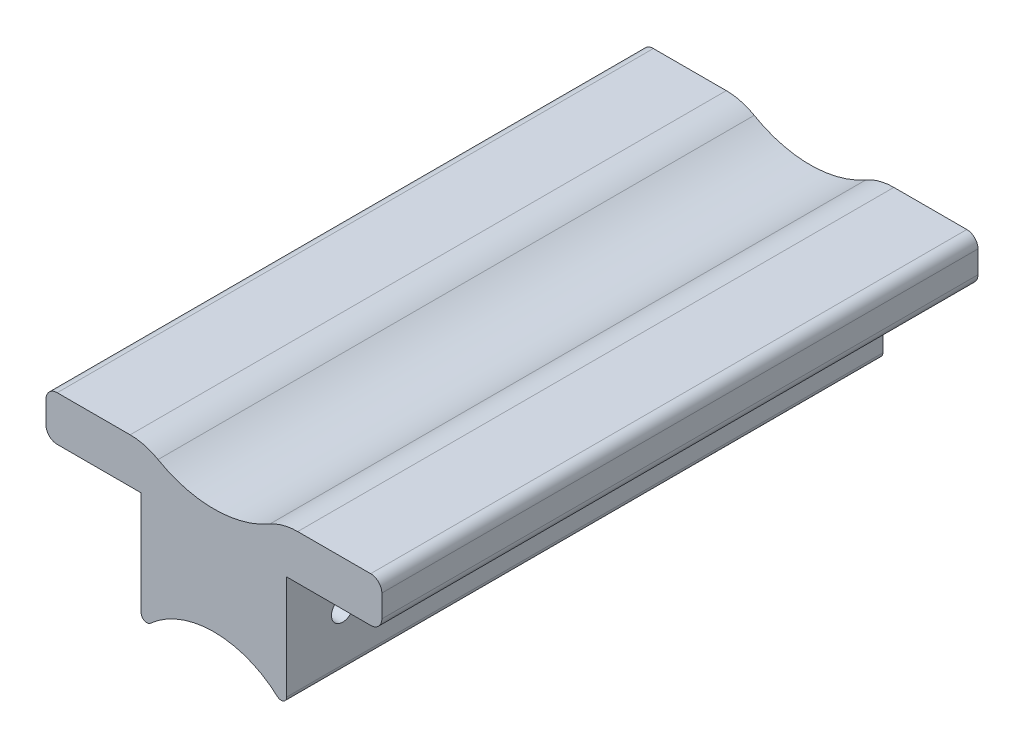
ISO-10303-21;
HEADER;
FILE_DESCRIPTION(('STEP AP214'),'2;1');
FILE_NAME('part.step','',(''),(''),'','','');
FILE_SCHEMA(('AUTOMOTIVE_DESIGN { 1 0 10303 214 1 1 1 1 }'));
ENDSEC;
DATA;
#1=APPLICATION_CONTEXT('core data for automotive mechanical design processes');
#2=APPLICATION_PROTOCOL_DEFINITION('international standard','automotive_design',2000,#1);
#3=PRODUCT_CONTEXT('',#1,'mechanical');
#4=PRODUCT('Part','Part','',(#3));
#5=PRODUCT_RELATED_PRODUCT_CATEGORY('part','',(#4));
#6=PRODUCT_DEFINITION_FORMATION('','',#4);
#7=PRODUCT_DEFINITION_CONTEXT('part definition',#1,'design');
#8=PRODUCT_DEFINITION('design','',#6,#7);
#9=PRODUCT_DEFINITION_SHAPE('','',#8);
#10=(LENGTH_UNIT() NAMED_UNIT(*) SI_UNIT(.MILLI.,.METRE.));
#11=(NAMED_UNIT(*) PLANE_ANGLE_UNIT() SI_UNIT($,.RADIAN.));
#12=(NAMED_UNIT(*) SI_UNIT($,.STERADIAN.) SOLID_ANGLE_UNIT());
#13=UNCERTAINTY_MEASURE_WITH_UNIT(LENGTH_MEASURE(1.E-05),#10,'distance_accuracy_value','');
#14=(GEOMETRIC_REPRESENTATION_CONTEXT(3) GLOBAL_UNCERTAINTY_ASSIGNED_CONTEXT((#13)) GLOBAL_UNIT_ASSIGNED_CONTEXT((#10,
#11,#12)) REPRESENTATION_CONTEXT('',''));
#15=CARTESIAN_POINT('',(0.,0.,0.));
#16=DIRECTION('',(0.,0.,1.));
#17=DIRECTION('',(1.,0.,0.));
#18=AXIS2_PLACEMENT_3D('',#15,#16,#17);
#19=CARTESIAN_POINT('',(-30.,40.,106.5));
#20=DIRECTION('',(0.,-1.,0.));
#21=DIRECTION('',(0.,0.,-1.));
#22=AXIS2_PLACEMENT_3D('',#19,#20,#21);
#23=PLANE('',#22);
#24=DIRECTION('',(-1.,0.,0.));
#25=VECTOR('',#24,1.);
#26=CARTESIAN_POINT('',(-30.,40.,0.));
#27=LINE('',#26,#25);
#28=CARTESIAN_POINT('',(-14.9666295470958,40.,0.));
#29=VERTEX_POINT('',#28);
#30=CARTESIAN_POINT('',(-28.,40.,0.));
#31=VERTEX_POINT('',#30);
#32=EDGE_CURVE('E221',#29,#31,#27,.T.);
#33=ORIENTED_EDGE('',*,*,#32,.T.);
#34=DIRECTION('',(0.,0.,-1.));
#35=VECTOR('',#34,1.);
#36=CARTESIAN_POINT('',(-28.,40.,106.5));
#37=LINE('',#36,#35);
#38=CARTESIAN_POINT('',(-28.,40.,106.5));
#39=VERTEX_POINT('',#38);
#40=EDGE_CURVE('E266',#31,#39,#37,.F.);
#41=ORIENTED_EDGE('',*,*,#40,.T.);
#42=DIRECTION('',(-1.,0.,0.));
#43=VECTOR('',#42,1.);
#44=CARTESIAN_POINT('',(-30.,40.,106.5));
#45=LINE('',#44,#43);
#46=CARTESIAN_POINT('',(-14.9666295470958,40.,106.5));
#47=VERTEX_POINT('',#46);
#48=EDGE_CURVE('E201',#47,#39,#45,.T.);
#49=ORIENTED_EDGE('',*,*,#48,.F.);
#50=DIRECTION('',(0.,0.,-1.));
#51=VECTOR('',#50,1.);
#52=CARTESIAN_POINT('',(-14.9666295470958,40.,106.5));
#53=LINE('',#52,#51);
#54=EDGE_CURVE('E184',#47,#29,#53,.T.);
#55=ORIENTED_EDGE('',*,*,#54,.T.);
#56=EDGE_LOOP('',(#33,#41,#49,#55));
#57=FACE_BOUND('',#56,.T.);
#58=ADVANCED_FACE('F39',(#57),#23,.F.);
#59=CARTESIAN_POINT('',(-30.,32.,106.5));
#60=DIRECTION('',(1.,0.,0.));
#61=DIRECTION('',(0.,0.,-1.));
#62=AXIS2_PLACEMENT_3D('',#59,#60,#61);
#63=PLANE('',#62);
#64=DIRECTION('',(0.,-1.,0.));
#65=VECTOR('',#64,1.);
#66=CARTESIAN_POINT('',(-30.,32.,0.));
#67=LINE('',#66,#65);
#68=CARTESIAN_POINT('',(-30.,38.,0.));
#69=VERTEX_POINT('',#68);
#70=CARTESIAN_POINT('',(-30.,34.,0.));
#71=VERTEX_POINT('',#70);
#72=EDGE_CURVE('E204',#69,#71,#67,.T.);
#73=ORIENTED_EDGE('',*,*,#72,.T.);
#74=DIRECTION('',(0.,0.,-1.));
#75=VECTOR('',#74,1.);
#76=CARTESIAN_POINT('',(-30.,34.,106.5));
#77=LINE('',#76,#75);
#78=CARTESIAN_POINT('',(-30.,34.,106.5));
#79=VERTEX_POINT('',#78);
#80=EDGE_CURVE('E257',#71,#79,#77,.F.);
#81=ORIENTED_EDGE('',*,*,#80,.T.);
#82=DIRECTION('',(0.,-1.,0.));
#83=VECTOR('',#82,1.);
#84=CARTESIAN_POINT('',(-30.,32.,106.5));
#85=LINE('',#84,#83);
#86=CARTESIAN_POINT('',(-30.,38.,106.5));
#87=VERTEX_POINT('',#86);
#88=EDGE_CURVE('E176',#87,#79,#85,.T.);
#89=ORIENTED_EDGE('',*,*,#88,.F.);
#90=DIRECTION('',(0.,0.,-1.));
#91=VECTOR('',#90,1.);
#92=CARTESIAN_POINT('',(-30.,38.,106.5));
#93=LINE('',#92,#91);
#94=EDGE_CURVE('E254',#87,#69,#93,.T.);
#95=ORIENTED_EDGE('',*,*,#94,.T.);
#96=EDGE_LOOP('',(#73,#81,#89,#95));
#97=FACE_BOUND('',#96,.T.);
#98=ADVANCED_FACE('F311',(#97),#63,.F.);
#99=CARTESIAN_POINT('',(-30.,32.,106.5));
#100=DIRECTION('',(0.,1.,0.));
#101=DIRECTION('',(0.,0.,1.));
#102=AXIS2_PLACEMENT_3D('',#99,#100,#101);
#103=PLANE('',#102);
#104=DIRECTION('',(1.,0.,0.));
#105=VECTOR('',#104,1.);
#106=CARTESIAN_POINT('',(-30.,32.,106.5));
#107=LINE('',#106,#105);
#108=CARTESIAN_POINT('',(-28.,32.,106.5));
#109=VERTEX_POINT('',#108);
#110=CARTESIAN_POINT('',(-13.,32.,106.5));
#111=VERTEX_POINT('',#110);
#112=EDGE_CURVE('E165',#109,#111,#107,.T.);
#113=ORIENTED_EDGE('',*,*,#112,.F.);
#114=DIRECTION('',(0.,0.,-1.));
#115=VECTOR('',#114,1.);
#116=CARTESIAN_POINT('',(-28.,32.,106.5));
#117=LINE('',#116,#115);
#118=CARTESIAN_POINT('',(-28.,32.,0.));
#119=VERTEX_POINT('',#118);
#120=EDGE_CURVE('E244',#109,#119,#117,.T.);
#121=ORIENTED_EDGE('',*,*,#120,.T.);
#122=DIRECTION('',(1.,0.,0.));
#123=VECTOR('',#122,1.);
#124=CARTESIAN_POINT('',(-30.,32.,0.));
#125=LINE('',#124,#123);
#126=CARTESIAN_POINT('',(-13.,32.,0.));
#127=VERTEX_POINT('',#126);
#128=EDGE_CURVE('E182',#119,#127,#125,.T.);
#129=ORIENTED_EDGE('',*,*,#128,.T.);
#130=DIRECTION('',(0.,0.,-1.));
#131=VECTOR('',#130,1.);
#132=CARTESIAN_POINT('',(-13.,32.,106.5));
#133=LINE('',#132,#131);
#134=EDGE_CURVE('E179',#111,#127,#133,.T.);
#135=ORIENTED_EDGE('',*,*,#134,.F.);
#136=EDGE_LOOP('',(#113,#121,#129,#135));
#137=FACE_BOUND('',#136,.T.);
#138=ADVANCED_FACE('F180',(#137),#103,.F.);
#139=CARTESIAN_POINT('',(-13.,32.,106.5));
#140=DIRECTION('',(1.,0.,0.));
#141=DIRECTION('',(0.,1.,0.));
#142=AXIS2_PLACEMENT_3D('',#139,#140,#141);
#143=PLANE('',#142);
#144=CARTESIAN_POINT('',(-13.,22.,9.99999999999999));
#145=DIRECTION('',(1.,0.,0.));
#146=DIRECTION('',(0.,1.,0.));
#147=AXIS2_PLACEMENT_3D('',#144,#145,#146);
#148=CIRCLE('',#147,2.);
#149=CARTESIAN_POINT('',(-13.,24.,9.99999999999999));
#150=VERTEX_POINT('',#149);
#151=EDGE_CURVE('E403',#150,#150,#148,.T.);
#152=ORIENTED_EDGE('',*,*,#151,.T.);
#153=EDGE_LOOP('',(#152));
#154=FACE_BOUND('',#153,.T.);
#155=CARTESIAN_POINT('',(-13.,22.,96.5));
#156=DIRECTION('',(1.,0.,0.));
#157=DIRECTION('',(0.,1.,0.));
#158=AXIS2_PLACEMENT_3D('',#155,#156,#157);
#159=CIRCLE('',#158,2.);
#160=CARTESIAN_POINT('',(-13.,24.,96.5));
#161=VERTEX_POINT('',#160);
#162=EDGE_CURVE('E407',#161,#161,#159,.T.);
#163=ORIENTED_EDGE('',*,*,#162,.T.);
#164=EDGE_LOOP('',(#163));
#165=FACE_BOUND('',#164,.T.);
#166=DIRECTION('',(0.,-1.,0.));
#167=VECTOR('',#166,1.);
#168=CARTESIAN_POINT('',(-13.,32.,0.));
#169=LINE('',#168,#167);
#170=CARTESIAN_POINT('',(-13.,13.4164078649987,0.));
#171=VERTEX_POINT('',#170);
#172=EDGE_CURVE('E209',#127,#171,#169,.T.);
#173=ORIENTED_EDGE('',*,*,#172,.T.);
#174=DIRECTION('',(0.,0.,-1.));
#175=VECTOR('',#174,1.);
#176=CARTESIAN_POINT('',(-13.,13.4164078649987,106.5));
#177=LINE('',#176,#175);
#178=CARTESIAN_POINT('',(-13.,13.4164078649987,106.5));
#179=VERTEX_POINT('',#178);
#180=EDGE_CURVE('E11',#171,#179,#177,.F.);
#181=ORIENTED_EDGE('',*,*,#180,.T.);
#182=DIRECTION('',(0.,-1.,0.));
#183=VECTOR('',#182,1.);
#184=CARTESIAN_POINT('',(-13.,32.,106.5));
#185=LINE('',#184,#183);
#186=EDGE_CURVE('E168',#111,#179,#185,.T.);
#187=ORIENTED_EDGE('',*,*,#186,.F.);
#188=ORIENTED_EDGE('',*,*,#134,.T.);
#189=EDGE_LOOP('',(#173,#181,#187,#188));
#190=FACE_BOUND('',#189,.T.);
#191=ADVANCED_FACE('F187',(#154,#165,#190),#143,.F.);
#192=CARTESIAN_POINT('',(0.,0.,106.5));
#193=DIRECTION('',(0.,0.,-1.));
#194=DIRECTION('',(-1.,0.,0.));
#195=AXIS2_PLACEMENT_3D('',#192,#193,#194);
#196=CYLINDRICAL_SURFACE('',#195,17.);
#197=CARTESIAN_POINT('',(0.,0.,0.));
#198=DIRECTION('',(0.,0.,-1.));
#199=DIRECTION('',(-1.,0.,0.));
#200=AXIS2_PLACEMENT_3D('',#197,#198,#199);
#201=CIRCLE('',#200,17.);
#202=CARTESIAN_POINT('',(-11.3333333333333,12.6710518724988,0.));
#203=VERTEX_POINT('',#202);
#204=CARTESIAN_POINT('',(11.3333333333333,12.6710518724988,0.));
#205=VERTEX_POINT('',#204);
#206=EDGE_CURVE('E211',#203,#205,#201,.T.);
#207=ORIENTED_EDGE('',*,*,#206,.T.);
#208=DIRECTION('',(0.,0.,-1.));
#209=VECTOR('',#208,1.);
#210=CARTESIAN_POINT('',(11.3333333333333,12.6710518724988,106.5));
#211=LINE('',#210,#209);
#212=CARTESIAN_POINT('',(11.3333333333333,12.6710518724988,106.5));
#213=VERTEX_POINT('',#212);
#214=EDGE_CURVE('E60',#205,#213,#211,.F.);
#215=ORIENTED_EDGE('',*,*,#214,.T.);
#216=CARTESIAN_POINT('',(0.,0.,106.5));
#217=DIRECTION('',(0.,0.,-1.));
#218=DIRECTION('',(-1.,0.,0.));
#219=AXIS2_PLACEMENT_3D('',#216,#217,#218);
#220=CIRCLE('',#219,17.);
#221=CARTESIAN_POINT('',(-11.3333333333333,12.6710518724988,106.5));
#222=VERTEX_POINT('',#221);
#223=EDGE_CURVE('E188',#222,#213,#220,.T.);
#224=ORIENTED_EDGE('',*,*,#223,.F.);
#225=DIRECTION('',(0.,0.,-1.));
#226=VECTOR('',#225,1.);
#227=CARTESIAN_POINT('',(-11.3333333333333,12.6710518724988,106.5));
#228=LINE('',#227,#226);
#229=EDGE_CURVE('E285',#222,#203,#228,.T.);
#230=ORIENTED_EDGE('',*,*,#229,.T.);
#231=EDGE_LOOP('',(#207,#215,#224,#230));
#232=FACE_BOUND('',#231,.T.);
#233=ADVANCED_FACE('F304',(#232),#196,.F.);
#234=CARTESIAN_POINT('',(13.,32.,106.5));
#235=DIRECTION('',(-1.,0.,0.));
#236=DIRECTION('',(0.,-1.,0.));
#237=AXIS2_PLACEMENT_3D('',#234,#235,#236);
#238=PLANE('',#237);
#239=CARTESIAN_POINT('',(13.,22.,9.99999999999999));
#240=DIRECTION('',(1.,0.,0.));
#241=DIRECTION('',(0.,1.,0.));
#242=AXIS2_PLACEMENT_3D('',#239,#240,#241);
#243=CIRCLE('',#242,2.);
#244=CARTESIAN_POINT('',(13.,24.,9.99999999999999));
#245=VERTEX_POINT('',#244);
#246=EDGE_CURVE('E410',#245,#245,#243,.T.);
#247=ORIENTED_EDGE('',*,*,#246,.F.);
#248=EDGE_LOOP('',(#247));
#249=FACE_BOUND('',#248,.T.);
#250=CARTESIAN_POINT('',(13.,22.,96.5));
#251=DIRECTION('',(1.,0.,0.));
#252=DIRECTION('',(0.,1.,0.));
#253=AXIS2_PLACEMENT_3D('',#250,#251,#252);
#254=CIRCLE('',#253,2.);
#255=CARTESIAN_POINT('',(13.,24.,96.5));
#256=VERTEX_POINT('',#255);
#257=EDGE_CURVE('E411',#256,#256,#254,.T.);
#258=ORIENTED_EDGE('',*,*,#257,.F.);
#259=EDGE_LOOP('',(#258));
#260=FACE_BOUND('',#259,.T.);
#261=DIRECTION('',(0.,1.,0.));
#262=VECTOR('',#261,1.);
#263=CARTESIAN_POINT('',(13.,32.,106.5));
#264=LINE('',#263,#262);
#265=CARTESIAN_POINT('',(13.,13.4164078649987,106.5));
#266=VERTEX_POINT('',#265);
#267=CARTESIAN_POINT('',(13.,32.,106.5));
#268=VERTEX_POINT('',#267);
#269=EDGE_CURVE('E190',#266,#268,#264,.T.);
#270=ORIENTED_EDGE('',*,*,#269,.F.);
#271=DIRECTION('',(0.,0.,-1.));
#272=VECTOR('',#271,1.);
#273=CARTESIAN_POINT('',(13.,13.4164078649987,106.5));
#274=LINE('',#273,#272);
#275=CARTESIAN_POINT('',(13.,13.4164078649987,0.));
#276=VERTEX_POINT('',#275);
#277=EDGE_CURVE('E278',#266,#276,#274,.T.);
#278=ORIENTED_EDGE('',*,*,#277,.T.);
#279=DIRECTION('',(0.,1.,0.));
#280=VECTOR('',#279,1.);
#281=CARTESIAN_POINT('',(13.,32.,0.));
#282=LINE('',#281,#280);
#283=CARTESIAN_POINT('',(13.,32.,0.));
#284=VERTEX_POINT('',#283);
#285=EDGE_CURVE('E213',#276,#284,#282,.T.);
#286=ORIENTED_EDGE('',*,*,#285,.T.);
#287=DIRECTION('',(0.,0.,-1.));
#288=VECTOR('',#287,1.);
#289=CARTESIAN_POINT('',(13.,32.,106.5));
#290=LINE('',#289,#288);
#291=EDGE_CURVE('E185',#268,#284,#290,.T.);
#292=ORIENTED_EDGE('',*,*,#291,.F.);
#293=EDGE_LOOP('',(#270,#278,#286,#292));
#294=FACE_BOUND('',#293,.T.);
#295=ADVANCED_FACE('F296',(#249,#260,#294),#238,.F.);
#296=CARTESIAN_POINT('',(30.,32.,106.5));
#297=DIRECTION('',(0.,1.,0.));
#298=DIRECTION('',(0.,0.,1.));
#299=AXIS2_PLACEMENT_3D('',#296,#297,#298);
#300=PLANE('',#299);
#301=DIRECTION('',(1.,0.,0.));
#302=VECTOR('',#301,1.);
#303=CARTESIAN_POINT('',(30.,32.,0.));
#304=LINE('',#303,#302);
#305=CARTESIAN_POINT('',(28.,32.,0.));
#306=VERTEX_POINT('',#305);
#307=EDGE_CURVE('E215',#284,#306,#304,.T.);
#308=ORIENTED_EDGE('',*,*,#307,.T.);
#309=DIRECTION('',(0.,0.,-1.));
#310=VECTOR('',#309,1.);
#311=CARTESIAN_POINT('',(28.,32.,106.5));
#312=LINE('',#311,#310);
#313=CARTESIAN_POINT('',(28.,32.,106.5));
#314=VERTEX_POINT('',#313);
#315=EDGE_CURVE('E273',#306,#314,#312,.F.);
#316=ORIENTED_EDGE('',*,*,#315,.T.);
#317=DIRECTION('',(1.,0.,0.));
#318=VECTOR('',#317,1.);
#319=CARTESIAN_POINT('',(30.,32.,106.5));
#320=LINE('',#319,#318);
#321=EDGE_CURVE('E195',#268,#314,#320,.T.);
#322=ORIENTED_EDGE('',*,*,#321,.F.);
#323=ORIENTED_EDGE('',*,*,#291,.T.);
#324=EDGE_LOOP('',(#308,#316,#322,#323));
#325=FACE_BOUND('',#324,.T.);
#326=ADVANCED_FACE('F348',(#325),#300,.F.);
#327=CARTESIAN_POINT('',(30.,32.,106.5));
#328=DIRECTION('',(-1.,0.,0.));
#329=DIRECTION('',(0.,0.,1.));
#330=AXIS2_PLACEMENT_3D('',#327,#328,#329);
#331=PLANE('',#330);
#332=DIRECTION('',(0.,1.,0.));
#333=VECTOR('',#332,1.);
#334=CARTESIAN_POINT('',(30.,32.,106.5));
#335=LINE('',#334,#333);
#336=CARTESIAN_POINT('',(30.,34.,106.5));
#337=VERTEX_POINT('',#336);
#338=CARTESIAN_POINT('',(30.,38.,106.5));
#339=VERTEX_POINT('',#338);
#340=EDGE_CURVE('E198',#337,#339,#335,.T.);
#341=ORIENTED_EDGE('',*,*,#340,.F.);
#342=DIRECTION('',(0.,0.,-1.));
#343=VECTOR('',#342,1.);
#344=CARTESIAN_POINT('',(30.,34.,106.5));
#345=LINE('',#344,#343);
#346=CARTESIAN_POINT('',(30.,34.,0.));
#347=VERTEX_POINT('',#346);
#348=EDGE_CURVE('E270',#337,#347,#345,.T.);
#349=ORIENTED_EDGE('',*,*,#348,.T.);
#350=DIRECTION('',(0.,1.,0.));
#351=VECTOR('',#350,1.);
#352=CARTESIAN_POINT('',(30.,32.,0.));
#353=LINE('',#352,#351);
#354=CARTESIAN_POINT('',(30.,38.,0.));
#355=VERTEX_POINT('',#354);
#356=EDGE_CURVE('E218',#347,#355,#353,.T.);
#357=ORIENTED_EDGE('',*,*,#356,.T.);
#358=DIRECTION('',(0.,0.,-1.));
#359=VECTOR('',#358,1.);
#360=CARTESIAN_POINT('',(30.,38.,106.5));
#361=LINE('',#360,#359);
#362=EDGE_CURVE('E268',#355,#339,#361,.F.);
#363=ORIENTED_EDGE('',*,*,#362,.T.);
#364=EDGE_LOOP('',(#341,#349,#357,#363));
#365=FACE_BOUND('',#364,.T.);
#366=ADVANCED_FACE('F341',(#365),#331,.F.);
#367=CARTESIAN_POINT('',(28.,40.,106.5));
#368=VERTEX_POINT('',#367);
#369=CARTESIAN_POINT('',(14.9666295470958,40.,106.5));
#370=VERTEX_POINT('',#369);
#371=EDGE_CURVE('E202',#368,#370,#45,.T.);
#372=ORIENTED_EDGE('',*,*,#371,.F.);
#373=DIRECTION('',(0.,0.,-1.));
#374=VECTOR('',#373,1.);
#375=CARTESIAN_POINT('',(28.,40.,106.5));
#376=LINE('',#375,#374);
#377=CARTESIAN_POINT('',(28.,40.,0.));
#378=VERTEX_POINT('',#377);
#379=EDGE_CURVE('E275',#368,#378,#376,.T.);
#380=ORIENTED_EDGE('',*,*,#379,.T.);
#381=CARTESIAN_POINT('',(14.9666295470958,40.,0.));
#382=VERTEX_POINT('',#381);
#383=EDGE_CURVE('E222',#378,#382,#27,.T.);
#384=ORIENTED_EDGE('',*,*,#383,.T.);
#385=DIRECTION('',(0.,0.,-1.));
#386=VECTOR('',#385,1.);
#387=CARTESIAN_POINT('',(14.9666295470958,40.,106.5));
#388=LINE('',#387,#386);
#389=EDGE_CURVE('E241',#382,#370,#388,.F.);
#390=ORIENTED_EDGE('',*,*,#389,.T.);
#391=EDGE_LOOP('',(#372,#380,#384,#390));
#392=FACE_BOUND('',#391,.T.);
#393=ADVANCED_FACE('F333',(#392),#23,.F.);
#394=CARTESIAN_POINT('',(0.,0.,106.5));
#395=DIRECTION('',(0.,0.,-1.));
#396=DIRECTION('',(-1.,0.,0.));
#397=AXIS2_PLACEMENT_3D('',#394,#395,#396);
#398=PLANE('',#397);
#399=ORIENTED_EDGE('',*,*,#223,.T.);
#400=CARTESIAN_POINT('',(12.,13.4164078649987,106.5));
#401=DIRECTION('',(0.,0.,-1.));
#402=DIRECTION('',(-1.,0.,0.));
#403=AXIS2_PLACEMENT_3D('',#400,#401,#402);
#404=CIRCLE('',#403,1.);
#405=EDGE_CURVE('E47',#213,#266,#404,.F.);
#406=ORIENTED_EDGE('',*,*,#405,.T.);
#407=ORIENTED_EDGE('',*,*,#269,.T.);
#408=ORIENTED_EDGE('',*,*,#321,.T.);
#409=CARTESIAN_POINT('',(28.,34.,106.5));
#410=DIRECTION('',(0.,0.,-1.));
#411=DIRECTION('',(-1.,0.,0.));
#412=AXIS2_PLACEMENT_3D('',#409,#410,#411);
#413=CIRCLE('',#412,2.);
#414=EDGE_CURVE('E261',#314,#337,#413,.F.);
#415=ORIENTED_EDGE('',*,*,#414,.T.);
#416=ORIENTED_EDGE('',*,*,#340,.T.);
#417=CARTESIAN_POINT('',(28.,38.,106.5));
#418=DIRECTION('',(0.,0.,-1.));
#419=DIRECTION('',(-1.,0.,0.));
#420=AXIS2_PLACEMENT_3D('',#417,#418,#419);
#421=CIRCLE('',#420,2.);
#422=EDGE_CURVE('E259',#339,#368,#421,.F.);
#423=ORIENTED_EDGE('',*,*,#422,.T.);
#424=ORIENTED_EDGE('',*,*,#371,.T.);
#425=CARTESIAN_POINT('',(14.9666295470958,30.,106.5));
#426=DIRECTION('',(0.,0.,-1.));
#427=DIRECTION('',(-1.,0.,0.));
#428=AXIS2_PLACEMENT_3D('',#425,#426,#427);
#429=CIRCLE('',#428,10.);
#430=CARTESIAN_POINT('',(9.97775303139719,38.6666666666667,106.5));
#431=VERTEX_POINT('',#430);
#432=EDGE_CURVE('E237',#370,#431,#429,.F.);
#433=ORIENTED_EDGE('',*,*,#432,.T.);
#434=CARTESIAN_POINT('',(0.,56.,106.5));
#435=DIRECTION('',(0.,0.,-1.));
#436=DIRECTION('',(-1.,0.,0.));
#437=AXIS2_PLACEMENT_3D('',#434,#435,#436);
#438=CIRCLE('',#437,20.);
#439=CARTESIAN_POINT('',(-9.97775303139719,38.6666666666667,106.5));
#440=VERTEX_POINT('',#439);
#441=EDGE_CURVE('E207',#431,#440,#438,.T.);
#442=ORIENTED_EDGE('',*,*,#441,.T.);
#443=CARTESIAN_POINT('',(-14.9666295470958,30.,106.5));
#444=DIRECTION('',(0.,0.,-1.));
#445=DIRECTION('',(-1.,0.,0.));
#446=AXIS2_PLACEMENT_3D('',#443,#444,#445);
#447=CIRCLE('',#446,10.);
#448=EDGE_CURVE('E239',#440,#47,#447,.F.);
#449=ORIENTED_EDGE('',*,*,#448,.T.);
#450=ORIENTED_EDGE('',*,*,#48,.T.);
#451=CARTESIAN_POINT('',(-28.,38.,106.5));
#452=DIRECTION('',(0.,0.,-1.));
#453=DIRECTION('',(-1.,0.,0.));
#454=AXIS2_PLACEMENT_3D('',#451,#452,#453);
#455=CIRCLE('',#454,2.);
#456=EDGE_CURVE('E263',#39,#87,#455,.F.);
#457=ORIENTED_EDGE('',*,*,#456,.T.);
#458=ORIENTED_EDGE('',*,*,#88,.T.);
#459=CARTESIAN_POINT('',(-28.,34.,106.5));
#460=DIRECTION('',(0.,0.,-1.));
#461=DIRECTION('',(-1.,0.,0.));
#462=AXIS2_PLACEMENT_3D('',#459,#460,#461);
#463=CIRCLE('',#462,2.);
#464=EDGE_CURVE('E172',#79,#109,#463,.F.);
#465=ORIENTED_EDGE('',*,*,#464,.T.);
#466=ORIENTED_EDGE('',*,*,#112,.T.);
#467=ORIENTED_EDGE('',*,*,#186,.T.);
#468=CARTESIAN_POINT('',(-12.,13.4164078649987,106.5));
#469=DIRECTION('',(0.,0.,-1.));
#470=DIRECTION('',(-1.,0.,0.));
#471=AXIS2_PLACEMENT_3D('',#468,#469,#470);
#472=CIRCLE('',#471,1.);
#473=EDGE_CURVE('E289',#179,#222,#472,.F.);
#474=ORIENTED_EDGE('',*,*,#473,.T.);
#475=EDGE_LOOP('',(#399,#406,#407,#408,#415,#416,#423,#424,#433,#442,#449,#450,#457,#458,#465,
#466,#467,#474));
#476=FACE_BOUND('',#475,.T.);
#477=ADVANCED_FACE('F167',(#476),#398,.F.);
#478=CARTESIAN_POINT('',(0.,0.,0.));
#479=DIRECTION('',(0.,0.,-1.));
#480=DIRECTION('',(-1.,0.,0.));
#481=AXIS2_PLACEMENT_3D('',#478,#479,#480);
#482=PLANE('',#481);
#483=ORIENTED_EDGE('',*,*,#285,.F.);
#484=CARTESIAN_POINT('',(12.,13.4164078649987,0.));
#485=DIRECTION('',(0.,0.,-1.));
#486=DIRECTION('',(-1.,0.,0.));
#487=AXIS2_PLACEMENT_3D('',#484,#485,#486);
#488=CIRCLE('',#487,1.);
#489=EDGE_CURVE('E283',#276,#205,#488,.T.);
#490=ORIENTED_EDGE('',*,*,#489,.T.);
#491=ORIENTED_EDGE('',*,*,#206,.F.);
#492=CARTESIAN_POINT('',(-12.,13.4164078649987,0.));
#493=DIRECTION('',(0.,0.,-1.));
#494=DIRECTION('',(-1.,0.,0.));
#495=AXIS2_PLACEMENT_3D('',#492,#493,#494);
#496=CIRCLE('',#495,1.);
#497=EDGE_CURVE('E281',#203,#171,#496,.T.);
#498=ORIENTED_EDGE('',*,*,#497,.T.);
#499=ORIENTED_EDGE('',*,*,#172,.F.);
#500=ORIENTED_EDGE('',*,*,#128,.F.);
#501=CARTESIAN_POINT('',(-28.,34.,0.));
#502=DIRECTION('',(0.,0.,-1.));
#503=DIRECTION('',(-1.,0.,0.));
#504=AXIS2_PLACEMENT_3D('',#501,#502,#503);
#505=CIRCLE('',#504,2.);
#506=EDGE_CURVE('E252',#119,#71,#505,.T.);
#507=ORIENTED_EDGE('',*,*,#506,.T.);
#508=ORIENTED_EDGE('',*,*,#72,.F.);
#509=CARTESIAN_POINT('',(-28.,38.,0.));
#510=DIRECTION('',(0.,0.,-1.));
#511=DIRECTION('',(-1.,0.,0.));
#512=AXIS2_PLACEMENT_3D('',#509,#510,#511);
#513=CIRCLE('',#512,2.);
#514=EDGE_CURVE('E250',#69,#31,#513,.T.);
#515=ORIENTED_EDGE('',*,*,#514,.T.);
#516=ORIENTED_EDGE('',*,*,#32,.F.);
#517=CARTESIAN_POINT('',(-14.9666295470958,30.,0.));
#518=DIRECTION('',(0.,0.,-1.));
#519=DIRECTION('',(-1.,0.,0.));
#520=AXIS2_PLACEMENT_3D('',#517,#518,#519);
#521=CIRCLE('',#520,10.);
#522=CARTESIAN_POINT('',(-9.97775303139719,38.6666666666667,0.));
#523=VERTEX_POINT('',#522);
#524=EDGE_CURVE('E231',#29,#523,#521,.T.);
#525=ORIENTED_EDGE('',*,*,#524,.T.);
#526=CARTESIAN_POINT('',(0.,56.,0.));
#527=DIRECTION('',(0.,0.,-1.));
#528=DIRECTION('',(-1.,0.,0.));
#529=AXIS2_PLACEMENT_3D('',#526,#527,#528);
#530=CIRCLE('',#529,20.);
#531=CARTESIAN_POINT('',(9.97775303139719,38.6666666666667,0.));
#532=VERTEX_POINT('',#531);
#533=EDGE_CURVE('E400',#532,#523,#530,.T.);
#534=ORIENTED_EDGE('',*,*,#533,.F.);
#535=CARTESIAN_POINT('',(14.9666295470958,30.,0.));
#536=DIRECTION('',(0.,0.,-1.));
#537=DIRECTION('',(-1.,0.,0.));
#538=AXIS2_PLACEMENT_3D('',#535,#536,#537);
#539=CIRCLE('',#538,10.);
#540=EDGE_CURVE('E228',#532,#382,#539,.T.);
#541=ORIENTED_EDGE('',*,*,#540,.T.);
#542=ORIENTED_EDGE('',*,*,#383,.F.);
#543=CARTESIAN_POINT('',(28.,38.,0.));
#544=DIRECTION('',(0.,0.,-1.));
#545=DIRECTION('',(-1.,0.,0.));
#546=AXIS2_PLACEMENT_3D('',#543,#544,#545);
#547=CIRCLE('',#546,2.);
#548=EDGE_CURVE('E246',#378,#355,#547,.T.);
#549=ORIENTED_EDGE('',*,*,#548,.T.);
#550=ORIENTED_EDGE('',*,*,#356,.F.);
#551=CARTESIAN_POINT('',(28.,34.,0.));
#552=DIRECTION('',(0.,0.,-1.));
#553=DIRECTION('',(-1.,0.,0.));
#554=AXIS2_PLACEMENT_3D('',#551,#552,#553);
#555=CIRCLE('',#554,2.);
#556=EDGE_CURVE('E248',#347,#306,#555,.T.);
#557=ORIENTED_EDGE('',*,*,#556,.T.);
#558=ORIENTED_EDGE('',*,*,#307,.F.);
#559=EDGE_LOOP('',(#483,#490,#491,#498,#499,#500,#507,#508,#515,#516,#525,#534,#541,#542,#549,
#550,#557,#558));
#560=FACE_BOUND('',#559,.T.);
#561=ADVANCED_FACE('F302',(#560),#482,.T.);
#562=CARTESIAN_POINT('',(0.,56.,106.5));
#563=DIRECTION('',(0.,0.,-1.));
#564=DIRECTION('',(-1.,0.,0.));
#565=AXIS2_PLACEMENT_3D('',#562,#563,#564);
#566=CYLINDRICAL_SURFACE('',#565,20.);
#567=ORIENTED_EDGE('',*,*,#533,.T.);
#568=DIRECTION('',(0.,0.,-1.));
#569=VECTOR('',#568,1.);
#570=CARTESIAN_POINT('',(-9.9777530313972,38.6666666666667,106.5));
#571=LINE('',#570,#569);
#572=EDGE_CURVE('E235',#523,#440,#571,.F.);
#573=ORIENTED_EDGE('',*,*,#572,.T.);
#574=ORIENTED_EDGE('',*,*,#441,.F.);
#575=DIRECTION('',(0.,0.,-1.));
#576=VECTOR('',#575,1.);
#577=CARTESIAN_POINT('',(9.9777530313972,38.6666666666667,106.5));
#578=LINE('',#577,#576);
#579=EDGE_CURVE('E233',#431,#532,#578,.T.);
#580=ORIENTED_EDGE('',*,*,#579,.T.);
#581=EDGE_LOOP('',(#567,#573,#574,#580));
#582=FACE_BOUND('',#581,.T.);
#583=ADVANCED_FACE('F382',(#582),#566,.F.);
#584=CARTESIAN_POINT('',(-14.9666295470958,30.,106.5));
#585=DIRECTION('',(0.,0.,-1.));
#586=DIRECTION('',(-1.,0.,0.));
#587=AXIS2_PLACEMENT_3D('',#584,#585,#586);
#588=CYLINDRICAL_SURFACE('',#587,10.);
#589=ORIENTED_EDGE('',*,*,#448,.F.);
#590=ORIENTED_EDGE('',*,*,#572,.F.);
#591=ORIENTED_EDGE('',*,*,#524,.F.);
#592=ORIENTED_EDGE('',*,*,#54,.F.);
#593=EDGE_LOOP('',(#589,#590,#591,#592));
#594=FACE_BOUND('',#593,.T.);
#595=ADVANCED_FACE('F327',(#594),#588,.T.);
#596=CARTESIAN_POINT('',(14.9666295470958,30.,106.5));
#597=DIRECTION('',(0.,0.,-1.));
#598=DIRECTION('',(-1.,0.,0.));
#599=AXIS2_PLACEMENT_3D('',#596,#597,#598);
#600=CYLINDRICAL_SURFACE('',#599,10.);
#601=ORIENTED_EDGE('',*,*,#540,.F.);
#602=ORIENTED_EDGE('',*,*,#579,.F.);
#603=ORIENTED_EDGE('',*,*,#432,.F.);
#604=ORIENTED_EDGE('',*,*,#389,.F.);
#605=EDGE_LOOP('',(#601,#602,#603,#604));
#606=FACE_BOUND('',#605,.T.);
#607=ADVANCED_FACE('F317',(#606),#600,.T.);
#608=CARTESIAN_POINT('',(-28.,34.,106.5));
#609=DIRECTION('',(0.,0.,-1.));
#610=DIRECTION('',(-1.,0.,0.));
#611=AXIS2_PLACEMENT_3D('',#608,#609,#610);
#612=CYLINDRICAL_SURFACE('',#611,2.);
#613=ORIENTED_EDGE('',*,*,#464,.F.);
#614=ORIENTED_EDGE('',*,*,#80,.F.);
#615=ORIENTED_EDGE('',*,*,#506,.F.);
#616=ORIENTED_EDGE('',*,*,#120,.F.);
#617=EDGE_LOOP('',(#613,#614,#615,#616));
#618=FACE_BOUND('',#617,.T.);
#619=ADVANCED_FACE('F314',(#618),#612,.T.);
#620=CARTESIAN_POINT('',(-28.,38.,106.5));
#621=DIRECTION('',(0.,0.,-1.));
#622=DIRECTION('',(-1.,0.,0.));
#623=AXIS2_PLACEMENT_3D('',#620,#621,#622);
#624=CYLINDRICAL_SURFACE('',#623,2.);
#625=ORIENTED_EDGE('',*,*,#456,.F.);
#626=ORIENTED_EDGE('',*,*,#40,.F.);
#627=ORIENTED_EDGE('',*,*,#514,.F.);
#628=ORIENTED_EDGE('',*,*,#94,.F.);
#629=EDGE_LOOP('',(#625,#626,#627,#628));
#630=FACE_BOUND('',#629,.T.);
#631=ADVANCED_FACE('F316',(#630),#624,.T.);
#632=CARTESIAN_POINT('',(28.,34.,106.5));
#633=DIRECTION('',(0.,0.,-1.));
#634=DIRECTION('',(-1.,0.,0.));
#635=AXIS2_PLACEMENT_3D('',#632,#633,#634);
#636=CYLINDRICAL_SURFACE('',#635,2.);
#637=ORIENTED_EDGE('',*,*,#414,.F.);
#638=ORIENTED_EDGE('',*,*,#315,.F.);
#639=ORIENTED_EDGE('',*,*,#556,.F.);
#640=ORIENTED_EDGE('',*,*,#348,.F.);
#641=EDGE_LOOP('',(#637,#638,#639,#640));
#642=FACE_BOUND('',#641,.T.);
#643=ADVANCED_FACE('F323',(#642),#636,.T.);
#644=CARTESIAN_POINT('',(28.,38.,106.5));
#645=DIRECTION('',(0.,0.,-1.));
#646=DIRECTION('',(-1.,0.,0.));
#647=AXIS2_PLACEMENT_3D('',#644,#645,#646);
#648=CYLINDRICAL_SURFACE('',#647,2.);
#649=ORIENTED_EDGE('',*,*,#422,.F.);
#650=ORIENTED_EDGE('',*,*,#362,.F.);
#651=ORIENTED_EDGE('',*,*,#548,.F.);
#652=ORIENTED_EDGE('',*,*,#379,.F.);
#653=EDGE_LOOP('',(#649,#650,#651,#652));
#654=FACE_BOUND('',#653,.T.);
#655=ADVANCED_FACE('F357',(#654),#648,.T.);
#656=CARTESIAN_POINT('',(12.,13.4164078649987,106.5));
#657=DIRECTION('',(0.,0.,-1.));
#658=DIRECTION('',(-1.,0.,0.));
#659=AXIS2_PLACEMENT_3D('',#656,#657,#658);
#660=CYLINDRICAL_SURFACE('',#659,1.);
#661=ORIENTED_EDGE('',*,*,#405,.F.);
#662=ORIENTED_EDGE('',*,*,#214,.F.);
#663=ORIENTED_EDGE('',*,*,#489,.F.);
#664=ORIENTED_EDGE('',*,*,#277,.F.);
#665=EDGE_LOOP('',(#661,#662,#663,#664));
#666=FACE_BOUND('',#665,.T.);
#667=ADVANCED_FACE('F299',(#666),#660,.T.);
#668=CARTESIAN_POINT('',(-12.,13.4164078649987,106.5));
#669=DIRECTION('',(0.,0.,-1.));
#670=DIRECTION('',(-1.,0.,0.));
#671=AXIS2_PLACEMENT_3D('',#668,#669,#670);
#672=CYLINDRICAL_SURFACE('',#671,1.);
#673=ORIENTED_EDGE('',*,*,#473,.F.);
#674=ORIENTED_EDGE('',*,*,#180,.F.);
#675=ORIENTED_EDGE('',*,*,#497,.F.);
#676=ORIENTED_EDGE('',*,*,#229,.F.);
#677=EDGE_LOOP('',(#673,#674,#675,#676));
#678=FACE_BOUND('',#677,.T.);
#679=ADVANCED_FACE('F41',(#678),#672,.T.);
#680=CARTESIAN_POINT('',(-30.,22.,96.5));
#681=DIRECTION('',(1.,0.,0.));
#682=DIRECTION('',(0.,1.,0.));
#683=AXIS2_PLACEMENT_3D('',#680,#681,#682);
#684=CYLINDRICAL_SURFACE('',#683,2.);
#685=ORIENTED_EDGE('',*,*,#257,.T.);
#686=EDGE_LOOP('',(#685));
#687=FACE_BOUND('',#686,.T.);
#688=ORIENTED_EDGE('',*,*,#162,.F.);
#689=EDGE_LOOP('',(#688));
#690=FACE_BOUND('',#689,.T.);
#691=ADVANCED_FACE('F422',(#687,#690),#684,.F.);
#692=CARTESIAN_POINT('',(-30.,22.,9.99999999999999));
#693=DIRECTION('',(1.,0.,0.));
#694=DIRECTION('',(0.,1.,0.));
#695=AXIS2_PLACEMENT_3D('',#692,#693,#694);
#696=CYLINDRICAL_SURFACE('',#695,2.);
#697=ORIENTED_EDGE('',*,*,#246,.T.);
#698=EDGE_LOOP('',(#697));
#699=FACE_BOUND('',#698,.T.);
#700=ORIENTED_EDGE('',*,*,#151,.F.);
#701=EDGE_LOOP('',(#700));
#702=FACE_BOUND('',#701,.T.);
#703=ADVANCED_FACE('F417',(#699,#702),#696,.F.);
#704=CLOSED_SHELL('',(#58,#98,#138,#191,#233,#295,#326,#366,#393,#477,#561,#583,#595,#607,#619,
#631,#643,#655,#667,#679,#691,#703));
#705=MANIFOLD_SOLID_BREP('B2',#704);
#706=ADVANCED_BREP_SHAPE_REPRESENTATION('',(#18,#705),#14);
#707=SHAPE_DEFINITION_REPRESENTATION(#9,#706);
ENDSEC;
END-ISO-10303-21;
